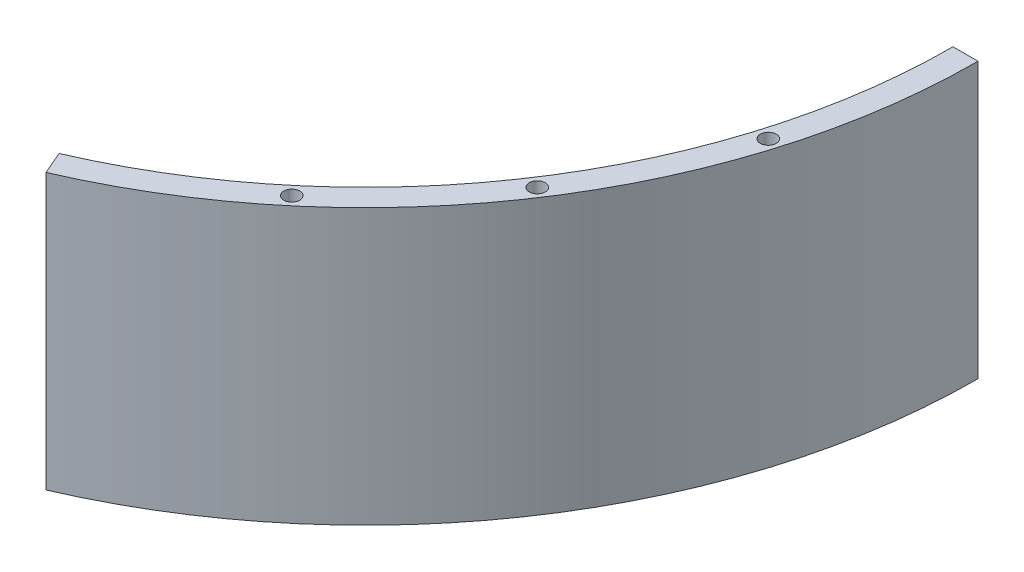
ISO-10303-21;
HEADER;
FILE_DESCRIPTION(('STEP AP214'),'2;1');
FILE_NAME('part.step','',(''),(''),'','','');
FILE_SCHEMA(('AUTOMOTIVE_DESIGN { 1 0 10303 214 1 1 1 1 }'));
ENDSEC;
DATA;
#1=APPLICATION_CONTEXT('core data for automotive mechanical design processes');
#2=APPLICATION_PROTOCOL_DEFINITION('international standard','automotive_design',2000,#1);
#3=PRODUCT_CONTEXT('',#1,'mechanical');
#4=PRODUCT('Part','Part','',(#3));
#5=PRODUCT_RELATED_PRODUCT_CATEGORY('part','',(#4));
#6=PRODUCT_DEFINITION_FORMATION('','',#4);
#7=PRODUCT_DEFINITION_CONTEXT('part definition',#1,'design');
#8=PRODUCT_DEFINITION('design','',#6,#7);
#9=PRODUCT_DEFINITION_SHAPE('','',#8);
#10=(LENGTH_UNIT() NAMED_UNIT(*) SI_UNIT(.MILLI.,.METRE.));
#11=(NAMED_UNIT(*) PLANE_ANGLE_UNIT() SI_UNIT($,.RADIAN.));
#12=(NAMED_UNIT(*) SI_UNIT($,.STERADIAN.) SOLID_ANGLE_UNIT());
#13=UNCERTAINTY_MEASURE_WITH_UNIT(LENGTH_MEASURE(1.E-05),#10,'distance_accuracy_value','');
#14=(GEOMETRIC_REPRESENTATION_CONTEXT(3) GLOBAL_UNCERTAINTY_ASSIGNED_CONTEXT((#13)) GLOBAL_UNIT_ASSIGNED_CONTEXT((#10,
#11,#12)) REPRESENTATION_CONTEXT('',''));
#15=CARTESIAN_POINT('',(0.,0.,0.));
#16=DIRECTION('',(0.,0.,1.));
#17=DIRECTION('',(1.,0.,0.));
#18=AXIS2_PLACEMENT_3D('',#15,#16,#17);
#19=CARTESIAN_POINT('',(0.,55.,0.));
#20=DIRECTION('',(0.,-1.,0.));
#21=DIRECTION('',(0.,0.,-1.));
#22=AXIS2_PLACEMENT_3D('',#19,#20,#21);
#23=CYLINDRICAL_SURFACE('',#22,117.5);
#24=CARTESIAN_POINT('',(0.,0.,0.));
#25=DIRECTION('',(0.,-1.,0.));
#26=DIRECTION('',(0.,0.,1.));
#27=AXIS2_PLACEMENT_3D('',#24,#25,#26);
#28=CIRCLE('',#27,117.5);
#29=CARTESIAN_POINT('',(117.5,0.,0.));
#30=VERTEX_POINT('',#29);
#31=CARTESIAN_POINT('',(46.5895819360198,0.,107.868720466254));
#32=VERTEX_POINT('',#31);
#33=EDGE_CURVE('E104',#30,#32,#28,.T.);
#34=ORIENTED_EDGE('',*,*,#33,.T.);
#35=DIRECTION('',(0.,-1.,0.));
#36=VECTOR('',#35,1.);
#37=CARTESIAN_POINT('',(46.5895819360198,55.,107.868720466254));
#38=LINE('',#37,#36);
#39=CARTESIAN_POINT('',(46.5895819360198,55.,107.868720466254));
#40=VERTEX_POINT('',#39);
#41=EDGE_CURVE('E11',#40,#32,#38,.T.);
#42=ORIENTED_EDGE('',*,*,#41,.F.);
#43=CARTESIAN_POINT('',(0.,55.,0.));
#44=DIRECTION('',(0.,-1.,0.));
#45=DIRECTION('',(0.,0.,1.));
#46=AXIS2_PLACEMENT_3D('',#43,#44,#45);
#47=CIRCLE('',#46,117.5);
#48=CARTESIAN_POINT('',(117.5,55.,0.));
#49=VERTEX_POINT('',#48);
#50=EDGE_CURVE('E92',#49,#40,#47,.T.);
#51=ORIENTED_EDGE('',*,*,#50,.F.);
#52=DIRECTION('',(0.,-1.,0.));
#53=VECTOR('',#52,1.);
#54=CARTESIAN_POINT('',(117.5,55.,0.));
#55=LINE('',#54,#53);
#56=EDGE_CURVE('E100',#49,#30,#55,.T.);
#57=ORIENTED_EDGE('',*,*,#56,.T.);
#58=EDGE_LOOP('',(#34,#42,#51,#57));
#59=FACE_BOUND('',#58,.T.);
#60=ADVANCED_FACE('F41',(#59),#23,.F.);
#61=CARTESIAN_POINT('',(46.5895819360198,55.,107.868720466254));
#62=DIRECTION('',(0.918031663542589,0.,-0.396507080306552));
#63=DIRECTION('',(-0.396507080306552,0.,-0.918031663542589));
#64=AXIS2_PLACEMENT_3D('',#61,#62,#63);
#65=PLANE('',#64);
#66=DIRECTION('',(0.396507080306552,0.,0.918031663542589));
#67=VECTOR('',#66,1.);
#68=CARTESIAN_POINT('',(46.5895819360198,0.,107.868720466254));
#69=LINE('',#68,#67);
#70=CARTESIAN_POINT('',(48.5721173375526,0.,112.458878783967));
#71=VERTEX_POINT('',#70);
#72=EDGE_CURVE('E96',#32,#71,#69,.T.);
#73=ORIENTED_EDGE('',*,*,#72,.T.);
#74=DIRECTION('',(0.,-1.,0.));
#75=VECTOR('',#74,1.);
#76=CARTESIAN_POINT('',(48.5721173375526,55.,112.458878783967));
#77=LINE('',#76,#75);
#78=CARTESIAN_POINT('',(48.5721173375526,55.,112.458878783967));
#79=VERTEX_POINT('',#78);
#80=EDGE_CURVE('E49',#79,#71,#77,.T.);
#81=ORIENTED_EDGE('',*,*,#80,.F.);
#82=DIRECTION('',(0.396507080306552,0.,0.918031663542589));
#83=VECTOR('',#82,1.);
#84=CARTESIAN_POINT('',(46.5895819360198,55.,107.868720466254));
#85=LINE('',#84,#83);
#86=EDGE_CURVE('E87',#40,#79,#85,.T.);
#87=ORIENTED_EDGE('',*,*,#86,.F.);
#88=ORIENTED_EDGE('',*,*,#41,.T.);
#89=EDGE_LOOP('',(#73,#81,#87,#88));
#90=FACE_BOUND('',#89,.T.);
#91=ADVANCED_FACE('F95',(#90),#65,.F.);
#92=CARTESIAN_POINT('',(0.,55.,0.));
#93=DIRECTION('',(0.,-1.,0.));
#94=DIRECTION('',(0.,0.,-1.));
#95=AXIS2_PLACEMENT_3D('',#92,#93,#94);
#96=CYLINDRICAL_SURFACE('',#95,122.5);
#97=CARTESIAN_POINT('',(0.,0.,0.));
#98=DIRECTION('',(0.,1.,0.));
#99=DIRECTION('',(0.,0.,1.));
#100=AXIS2_PLACEMENT_3D('',#97,#98,#99);
#101=CIRCLE('',#100,122.5);
#102=CARTESIAN_POINT('',(122.5,0.,0.));
#103=VERTEX_POINT('',#102);
#104=EDGE_CURVE('E74',#71,#103,#101,.T.);
#105=ORIENTED_EDGE('',*,*,#104,.T.);
#106=DIRECTION('',(0.,-1.,0.));
#107=VECTOR('',#106,1.);
#108=CARTESIAN_POINT('',(122.5,55.,0.));
#109=LINE('',#108,#107);
#110=CARTESIAN_POINT('',(122.5,55.,0.));
#111=VERTEX_POINT('',#110);
#112=EDGE_CURVE('E97',#111,#103,#109,.T.);
#113=ORIENTED_EDGE('',*,*,#112,.F.);
#114=CARTESIAN_POINT('',(0.,55.,0.));
#115=DIRECTION('',(0.,1.,0.));
#116=DIRECTION('',(0.,0.,1.));
#117=AXIS2_PLACEMENT_3D('',#114,#115,#116);
#118=CIRCLE('',#117,122.5);
#119=EDGE_CURVE('E90',#79,#111,#118,.T.);
#120=ORIENTED_EDGE('',*,*,#119,.F.);
#121=ORIENTED_EDGE('',*,*,#80,.T.);
#122=EDGE_LOOP('',(#105,#113,#120,#121));
#123=FACE_BOUND('',#122,.T.);
#124=ADVANCED_FACE('F98',(#123),#96,.T.);
#125=CARTESIAN_POINT('',(117.5,55.,0.));
#126=DIRECTION('',(0.,0.,1.));
#127=DIRECTION('',(1.,0.,0.));
#128=AXIS2_PLACEMENT_3D('',#125,#126,#127);
#129=PLANE('',#128);
#130=DIRECTION('',(-1.,0.,0.));
#131=VECTOR('',#130,1.);
#132=CARTESIAN_POINT('',(117.5,0.,0.));
#133=LINE('',#132,#131);
#134=EDGE_CURVE('E80',#103,#30,#133,.T.);
#135=ORIENTED_EDGE('',*,*,#134,.T.);
#136=ORIENTED_EDGE('',*,*,#56,.F.);
#137=DIRECTION('',(-1.,0.,0.));
#138=VECTOR('',#137,1.);
#139=CARTESIAN_POINT('',(117.5,55.,0.));
#140=LINE('',#139,#138);
#141=EDGE_CURVE('E57',#111,#49,#140,.T.);
#142=ORIENTED_EDGE('',*,*,#141,.F.);
#143=ORIENTED_EDGE('',*,*,#112,.T.);
#144=EDGE_LOOP('',(#135,#136,#142,#143));
#145=FACE_BOUND('',#144,.T.);
#146=ADVANCED_FACE('F112',(#145),#129,.F.);
#147=CARTESIAN_POINT('',(0.,55.,0.));
#148=DIRECTION('',(0.,1.,0.));
#149=DIRECTION('',(0.,0.,1.));
#150=AXIS2_PLACEMENT_3D('',#147,#148,#149);
#151=PLANE('',#150);
#152=CARTESIAN_POINT('',(77.1665964570273,55.,91.8984025499807));
#153=DIRECTION('',(0.,1.,0.));
#154=DIRECTION('',(0.,0.,1.));
#155=AXIS2_PLACEMENT_3D('',#152,#153,#154);
#156=CIRCLE('',#155,1.60000000000001);
#157=CARTESIAN_POINT('',(77.1665964570273,55.,93.4984025499807));
#158=VERTEX_POINT('',#157);
#159=EDGE_CURVE('E130',#158,#158,#156,.T.);
#160=ORIENTED_EDGE('',*,*,#159,.F.);
#161=EDGE_LOOP('',(#160));
#162=FACE_BOUND('',#161,.T.);
#163=CARTESIAN_POINT('',(100.273879840202,55.,65.917744362143));
#164=DIRECTION('',(0.,1.,0.));
#165=DIRECTION('',(0.,0.,1.));
#166=AXIS2_PLACEMENT_3D('',#163,#164,#165);
#167=CIRCLE('',#166,1.60000000000001);
#168=CARTESIAN_POINT('',(100.273879840202,55.,67.517744362143));
#169=VERTEX_POINT('',#168);
#170=EDGE_CURVE('E127',#169,#169,#167,.T.);
#171=ORIENTED_EDGE('',*,*,#170,.F.);
#172=EDGE_LOOP('',(#171));
#173=FACE_BOUND('',#172,.T.);
#174=CARTESIAN_POINT('',(114.962745228235,55.,34.4030116354355));
#175=DIRECTION('',(0.,1.,0.));
#176=DIRECTION('',(0.,0.,1.));
#177=AXIS2_PLACEMENT_3D('',#174,#175,#176);
#178=CIRCLE('',#177,1.60000000000001);
#179=CARTESIAN_POINT('',(114.962745228235,55.,36.0030116354355));
#180=VERTEX_POINT('',#179);
#181=EDGE_CURVE('E121',#180,#180,#178,.T.);
#182=ORIENTED_EDGE('',*,*,#181,.F.);
#183=EDGE_LOOP('',(#182));
#184=FACE_BOUND('',#183,.T.);
#185=ORIENTED_EDGE('',*,*,#50,.T.);
#186=ORIENTED_EDGE('',*,*,#86,.T.);
#187=ORIENTED_EDGE('',*,*,#119,.T.);
#188=ORIENTED_EDGE('',*,*,#141,.T.);
#189=EDGE_LOOP('',(#185,#186,#187,#188));
#190=FACE_BOUND('',#189,.T.);
#191=ADVANCED_FACE('F88',(#162,#173,#184,#190),#151,.T.);
#192=CARTESIAN_POINT('',(0.,0.,0.));
#193=DIRECTION('',(0.,1.,0.));
#194=DIRECTION('',(0.,0.,1.));
#195=AXIS2_PLACEMENT_3D('',#192,#193,#194);
#196=PLANE('',#195);
#197=ORIENTED_EDGE('',*,*,#33,.F.);
#198=ORIENTED_EDGE('',*,*,#134,.F.);
#199=ORIENTED_EDGE('',*,*,#104,.F.);
#200=ORIENTED_EDGE('',*,*,#72,.F.);
#201=EDGE_LOOP('',(#197,#198,#199,#200));
#202=FACE_BOUND('',#201,.T.);
#203=ADVANCED_FACE('F115',(#202),#196,.F.);
#204=CARTESIAN_POINT('',(114.962745228235,45.,34.4030116354355));
#205=DIRECTION('',(0.,1.,0.));
#206=DIRECTION('',(0.,0.,1.));
#207=AXIS2_PLACEMENT_3D('',#204,#205,#206);
#208=CYLINDRICAL_SURFACE('',#207,1.60000000000001);
#209=CARTESIAN_POINT('',(114.962745228235,45.,34.4030116354355));
#210=DIRECTION('',(0.,1.,0.));
#211=DIRECTION('',(0.,0.,1.));
#212=AXIS2_PLACEMENT_3D('',#209,#210,#211);
#213=CIRCLE('',#212,1.60000000000001);
#214=CARTESIAN_POINT('',(114.962745228235,45.,36.0030116354355));
#215=VERTEX_POINT('',#214);
#216=EDGE_CURVE('E118',#215,#215,#213,.T.);
#217=ORIENTED_EDGE('',*,*,#216,.F.);
#218=EDGE_LOOP('',(#217));
#219=FACE_BOUND('',#218,.T.);
#220=ORIENTED_EDGE('',*,*,#181,.T.);
#221=EDGE_LOOP('',(#220));
#222=FACE_BOUND('',#221,.T.);
#223=ADVANCED_FACE('F152',(#219,#222),#208,.F.);
#224=CARTESIAN_POINT('',(114.962745228235,45.,34.4030116354355));
#225=DIRECTION('',(0.,1.,0.));
#226=DIRECTION('',(0.,0.,1.));
#227=AXIS2_PLACEMENT_3D('',#224,#225,#226);
#228=PLANE('',#227);
#229=ORIENTED_EDGE('',*,*,#216,.T.);
#230=EDGE_LOOP('',(#229));
#231=FACE_BOUND('',#230,.T.);
#232=ADVANCED_FACE('F154',(#231),#228,.T.);
#233=CARTESIAN_POINT('',(100.273879840202,45.,65.917744362143));
#234=DIRECTION('',(0.,1.,0.));
#235=DIRECTION('',(0.,0.,1.));
#236=AXIS2_PLACEMENT_3D('',#233,#234,#235);
#237=CYLINDRICAL_SURFACE('',#236,1.60000000000001);
#238=CARTESIAN_POINT('',(100.273879840202,45.,65.917744362143));
#239=DIRECTION('',(0.,1.,0.));
#240=DIRECTION('',(0.,0.,1.));
#241=AXIS2_PLACEMENT_3D('',#238,#239,#240);
#242=CIRCLE('',#241,1.60000000000001);
#243=CARTESIAN_POINT('',(100.273879840202,45.,67.517744362143));
#244=VERTEX_POINT('',#243);
#245=EDGE_CURVE('E124',#244,#244,#242,.T.);
#246=ORIENTED_EDGE('',*,*,#245,.F.);
#247=EDGE_LOOP('',(#246));
#248=FACE_BOUND('',#247,.T.);
#249=ORIENTED_EDGE('',*,*,#170,.T.);
#250=EDGE_LOOP('',(#249));
#251=FACE_BOUND('',#250,.T.);
#252=ADVANCED_FACE('F161',(#248,#251),#237,.F.);
#253=CARTESIAN_POINT('',(100.273879840202,45.,65.917744362143));
#254=DIRECTION('',(0.,1.,0.));
#255=DIRECTION('',(0.,0.,1.));
#256=AXIS2_PLACEMENT_3D('',#253,#254,#255);
#257=PLANE('',#256);
#258=ORIENTED_EDGE('',*,*,#245,.T.);
#259=EDGE_LOOP('',(#258));
#260=FACE_BOUND('',#259,.T.);
#261=ADVANCED_FACE('F141',(#260),#257,.T.);
#262=CARTESIAN_POINT('',(77.1665964570273,45.,91.8984025499807));
#263=DIRECTION('',(0.,1.,0.));
#264=DIRECTION('',(0.,0.,1.));
#265=AXIS2_PLACEMENT_3D('',#262,#263,#264);
#266=CYLINDRICAL_SURFACE('',#265,1.60000000000001);
#267=CARTESIAN_POINT('',(77.1665964570273,45.,91.8984025499807));
#268=DIRECTION('',(0.,1.,0.));
#269=DIRECTION('',(0.,0.,1.));
#270=AXIS2_PLACEMENT_3D('',#267,#268,#269);
#271=CIRCLE('',#270,1.60000000000001);
#272=CARTESIAN_POINT('',(77.1665964570273,45.,93.4984025499807));
#273=VERTEX_POINT('',#272);
#274=EDGE_CURVE('E107',#273,#273,#271,.T.);
#275=ORIENTED_EDGE('',*,*,#274,.F.);
#276=EDGE_LOOP('',(#275));
#277=FACE_BOUND('',#276,.T.);
#278=ORIENTED_EDGE('',*,*,#159,.T.);
#279=EDGE_LOOP('',(#278));
#280=FACE_BOUND('',#279,.T.);
#281=ADVANCED_FACE('F138',(#277,#280),#266,.F.);
#282=CARTESIAN_POINT('',(77.1665964570273,45.,91.8984025499807));
#283=DIRECTION('',(0.,1.,0.));
#284=DIRECTION('',(0.,0.,1.));
#285=AXIS2_PLACEMENT_3D('',#282,#283,#284);
#286=PLANE('',#285);
#287=ORIENTED_EDGE('',*,*,#274,.T.);
#288=EDGE_LOOP('',(#287));
#289=FACE_BOUND('',#288,.T.);
#290=ADVANCED_FACE('F136',(#289),#286,.T.);
#291=CLOSED_SHELL('',(#60,#91,#124,#146,#191,#203,#223,#232,#252,#261,#281,#290));
#292=MANIFOLD_SOLID_BREP('B2',#291);
#293=ADVANCED_BREP_SHAPE_REPRESENTATION('',(#18,#292),#14);
#294=SHAPE_DEFINITION_REPRESENTATION(#9,#293);
ENDSEC;
END-ISO-10303-21;
